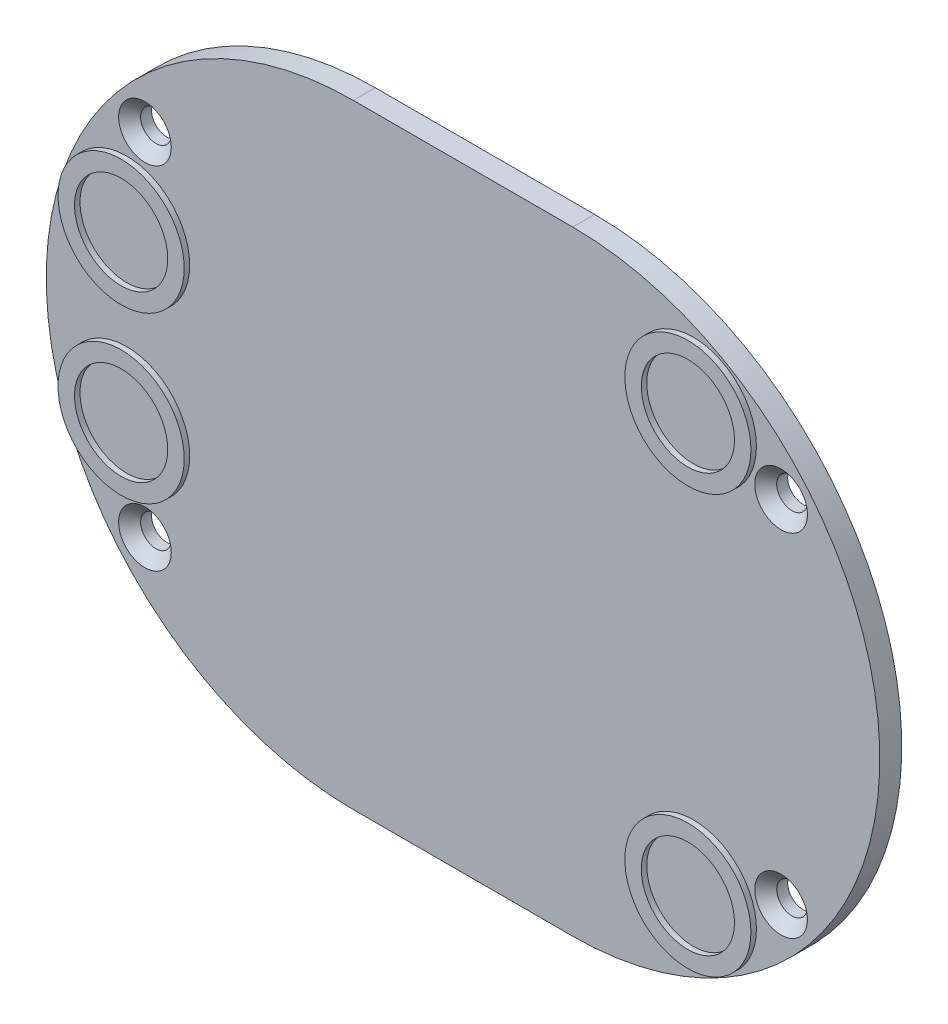
ISO-10303-21;
HEADER;
FILE_DESCRIPTION(('STEP AP214'),'2;1');
FILE_NAME('part.step','',(''),(''),'','','');
FILE_SCHEMA(('AUTOMOTIVE_DESIGN { 1 0 10303 214 1 1 1 1 }'));
ENDSEC;
DATA;
#1=APPLICATION_CONTEXT('core data for automotive mechanical design processes');
#2=APPLICATION_PROTOCOL_DEFINITION('international standard','automotive_design',2000,#1);
#3=PRODUCT_CONTEXT('',#1,'mechanical');
#4=PRODUCT('Part','Part','',(#3));
#5=PRODUCT_RELATED_PRODUCT_CATEGORY('part','',(#4));
#6=PRODUCT_DEFINITION_FORMATION('','',#4);
#7=PRODUCT_DEFINITION_CONTEXT('part definition',#1,'design');
#8=PRODUCT_DEFINITION('design','',#6,#7);
#9=PRODUCT_DEFINITION_SHAPE('','',#8);
#10=(LENGTH_UNIT() NAMED_UNIT(*) SI_UNIT(.MILLI.,.METRE.));
#11=(NAMED_UNIT(*) PLANE_ANGLE_UNIT() SI_UNIT($,.RADIAN.));
#12=(NAMED_UNIT(*) SI_UNIT($,.STERADIAN.) SOLID_ANGLE_UNIT());
#13=UNCERTAINTY_MEASURE_WITH_UNIT(LENGTH_MEASURE(1.E-05),#10,'distance_accuracy_value','');
#14=(GEOMETRIC_REPRESENTATION_CONTEXT(3) GLOBAL_UNCERTAINTY_ASSIGNED_CONTEXT((#13)) GLOBAL_UNIT_ASSIGNED_CONTEXT((#10,
#11,#12)) REPRESENTATION_CONTEXT('',''));
#15=CARTESIAN_POINT('',(0.,0.,0.));
#16=DIRECTION('',(0.,0.,1.));
#17=DIRECTION('',(1.,0.,0.));
#18=AXIS2_PLACEMENT_3D('',#15,#16,#17);
#19=CARTESIAN_POINT('',(-10.,0.,2.));
#20=DIRECTION('',(0.,0.,-1.));
#21=DIRECTION('',(-1.,0.,0.));
#22=AXIS2_PLACEMENT_3D('',#19,#20,#21);
#23=CYLINDRICAL_SURFACE('',#22,28.);
#24=CARTESIAN_POINT('',(-10.,0.,0.));
#25=DIRECTION('',(0.,0.,1.));
#26=DIRECTION('',(1.,0.,0.));
#27=AXIS2_PLACEMENT_3D('',#24,#25,#26);
#28=CIRCLE('',#27,28.);
#29=CARTESIAN_POINT('',(-10.,28.,0.));
#30=VERTEX_POINT('',#29);
#31=CARTESIAN_POINT('',(-10.,-28.,0.));
#32=VERTEX_POINT('',#31);
#33=EDGE_CURVE('E128',#30,#32,#28,.T.);
#34=ORIENTED_EDGE('',*,*,#33,.T.);
#35=DIRECTION('',(0.,0.,-1.));
#36=VECTOR('',#35,1.);
#37=CARTESIAN_POINT('',(-10.,-28.,2.));
#38=LINE('',#37,#36);
#39=CARTESIAN_POINT('',(-10.,-28.,2.));
#40=VERTEX_POINT('',#39);
#41=EDGE_CURVE('E115',#40,#32,#38,.T.);
#42=ORIENTED_EDGE('',*,*,#41,.F.);
#43=CARTESIAN_POINT('',(-10.,0.,2.));
#44=DIRECTION('',(0.,0.,1.));
#45=DIRECTION('',(1.,0.,0.));
#46=AXIS2_PLACEMENT_3D('',#43,#44,#45);
#47=CIRCLE('',#46,28.);
#48=CARTESIAN_POINT('',(-10.,28.,2.));
#49=VERTEX_POINT('',#48);
#50=EDGE_CURVE('E101',#49,#40,#47,.T.);
#51=ORIENTED_EDGE('',*,*,#50,.F.);
#52=DIRECTION('',(0.,0.,-1.));
#53=VECTOR('',#52,1.);
#54=CARTESIAN_POINT('',(-10.,28.,2.));
#55=LINE('',#54,#53);
#56=EDGE_CURVE('E75',#49,#30,#55,.T.);
#57=ORIENTED_EDGE('',*,*,#56,.T.);
#58=EDGE_LOOP('',(#34,#42,#51,#57));
#59=FACE_BOUND('',#58,.T.);
#60=ADVANCED_FACE('F59',(#59),#23,.T.);
#61=CARTESIAN_POINT('',(10.,-28.,2.));
#62=DIRECTION('',(0.,-1.,0.));
#63=DIRECTION('',(1.,0.,0.));
#64=AXIS2_PLACEMENT_3D('',#61,#62,#63);
#65=PLANE('',#64);
#66=DIRECTION('',(-1.,0.,0.));
#67=VECTOR('',#66,1.);
#68=CARTESIAN_POINT('',(10.,-28.,0.));
#69=LINE('',#68,#67);
#70=CARTESIAN_POINT('',(10.,-28.,0.));
#71=VERTEX_POINT('',#70);
#72=EDGE_CURVE('E112',#71,#32,#69,.T.);
#73=ORIENTED_EDGE('',*,*,#72,.F.);
#74=DIRECTION('',(0.,0.,-1.));
#75=VECTOR('',#74,1.);
#76=CARTESIAN_POINT('',(10.,-28.,2.));
#77=LINE('',#76,#75);
#78=CARTESIAN_POINT('',(10.,-28.,2.));
#79=VERTEX_POINT('',#78);
#80=EDGE_CURVE('E107',#79,#71,#77,.T.);
#81=ORIENTED_EDGE('',*,*,#80,.F.);
#82=DIRECTION('',(-1.,0.,0.));
#83=VECTOR('',#82,1.);
#84=CARTESIAN_POINT('',(10.,-28.,2.));
#85=LINE('',#84,#83);
#86=EDGE_CURVE('E110',#79,#40,#85,.T.);
#87=ORIENTED_EDGE('',*,*,#86,.T.);
#88=ORIENTED_EDGE('',*,*,#41,.T.);
#89=EDGE_LOOP('',(#73,#81,#87,#88));
#90=FACE_BOUND('',#89,.T.);
#91=ADVANCED_FACE('F109',(#90),#65,.T.);
#92=CARTESIAN_POINT('',(10.,0.,2.));
#93=DIRECTION('',(0.,0.,-1.));
#94=DIRECTION('',(-1.,0.,0.));
#95=AXIS2_PLACEMENT_3D('',#92,#93,#94);
#96=CYLINDRICAL_SURFACE('',#95,28.);
#97=CARTESIAN_POINT('',(10.,0.,0.));
#98=DIRECTION('',(0.,0.,1.));
#99=DIRECTION('',(1.,0.,0.));
#100=AXIS2_PLACEMENT_3D('',#97,#98,#99);
#101=CIRCLE('',#100,28.);
#102=CARTESIAN_POINT('',(10.,28.,0.));
#103=VERTEX_POINT('',#102);
#104=EDGE_CURVE('E132',#71,#103,#101,.T.);
#105=ORIENTED_EDGE('',*,*,#104,.T.);
#106=DIRECTION('',(0.,0.,-1.));
#107=VECTOR('',#106,1.);
#108=CARTESIAN_POINT('',(10.,28.,2.));
#109=LINE('',#108,#107);
#110=CARTESIAN_POINT('',(10.,28.,2.));
#111=VERTEX_POINT('',#110);
#112=EDGE_CURVE('E90',#111,#103,#109,.T.);
#113=ORIENTED_EDGE('',*,*,#112,.F.);
#114=CARTESIAN_POINT('',(10.,0.,2.));
#115=DIRECTION('',(0.,0.,1.));
#116=DIRECTION('',(1.,0.,0.));
#117=AXIS2_PLACEMENT_3D('',#114,#115,#116);
#118=CIRCLE('',#117,28.);
#119=EDGE_CURVE('E117',#79,#111,#118,.T.);
#120=ORIENTED_EDGE('',*,*,#119,.F.);
#121=ORIENTED_EDGE('',*,*,#80,.T.);
#122=EDGE_LOOP('',(#105,#113,#120,#121));
#123=FACE_BOUND('',#122,.T.);
#124=ADVANCED_FACE('F118',(#123),#96,.T.);
#125=CARTESIAN_POINT('',(-10.,28.,2.));
#126=DIRECTION('',(0.,1.,0.));
#127=DIRECTION('',(-1.,0.,0.));
#128=AXIS2_PLACEMENT_3D('',#125,#126,#127);
#129=PLANE('',#128);
#130=DIRECTION('',(1.,0.,0.));
#131=VECTOR('',#130,1.);
#132=CARTESIAN_POINT('',(-10.,28.,0.));
#133=LINE('',#132,#131);
#134=EDGE_CURVE('E123',#30,#103,#133,.T.);
#135=ORIENTED_EDGE('',*,*,#134,.F.);
#136=ORIENTED_EDGE('',*,*,#56,.F.);
#137=DIRECTION('',(1.,0.,0.));
#138=VECTOR('',#137,1.);
#139=CARTESIAN_POINT('',(-10.,28.,2.));
#140=LINE('',#139,#138);
#141=EDGE_CURVE('E119',#49,#111,#140,.T.);
#142=ORIENTED_EDGE('',*,*,#141,.T.);
#143=ORIENTED_EDGE('',*,*,#112,.T.);
#144=EDGE_LOOP('',(#135,#136,#142,#143));
#145=FACE_BOUND('',#144,.T.);
#146=ADVANCED_FACE('F201',(#145),#129,.T.);
#147=CARTESIAN_POINT('',(-10.,0.,2.));
#148=DIRECTION('',(0.,0.,1.));
#149=DIRECTION('',(1.,0.,0.));
#150=AXIS2_PLACEMENT_3D('',#147,#148,#149);
#151=PLANE('',#150);
#152=CARTESIAN_POINT('',(21.0000000000001,19.0525588832576,2.));
#153=DIRECTION('',(0.,0.,1.));
#154=DIRECTION('',(1.,0.,0.));
#155=AXIS2_PLACEMENT_3D('',#152,#153,#154);
#156=CIRCLE('',#155,5.75);
#157=CARTESIAN_POINT('',(26.7500000000001,19.0525588832576,2.));
#158=VERTEX_POINT('',#157);
#159=EDGE_CURVE('E301',#158,#158,#156,.T.);
#160=ORIENTED_EDGE('',*,*,#159,.F.);
#161=EDGE_LOOP('',(#160));
#162=FACE_BOUND('',#161,.T.);
#163=CARTESIAN_POINT('',(21.0000000000001,-19.0525588832576,2.));
#164=DIRECTION('',(0.,0.,1.));
#165=DIRECTION('',(1.,0.,0.));
#166=AXIS2_PLACEMENT_3D('',#163,#164,#165);
#167=CIRCLE('',#166,5.75);
#168=CARTESIAN_POINT('',(26.7500000000001,-19.0525588832576,2.));
#169=VERTEX_POINT('',#168);
#170=EDGE_CURVE('E312',#169,#169,#167,.T.);
#171=ORIENTED_EDGE('',*,*,#170,.F.);
#172=EDGE_LOOP('',(#171));
#173=FACE_BOUND('',#172,.T.);
#174=CARTESIAN_POINT('',(-30.67323765729,-7.52444315316473,2.));
#175=DIRECTION('',(0.,0.,1.));
#176=DIRECTION('',(1.,0.,0.));
#177=AXIS2_PLACEMENT_3D('',#174,#175,#176);
#178=CIRCLE('',#177,5.75);
#179=CARTESIAN_POINT('',(-24.92323765729,-7.52444315316473,2.));
#180=VERTEX_POINT('',#179);
#181=EDGE_CURVE('E321',#180,#180,#178,.T.);
#182=ORIENTED_EDGE('',*,*,#181,.F.);
#183=EDGE_LOOP('',(#182));
#184=FACE_BOUND('',#183,.T.);
#185=CARTESIAN_POINT('',(-30.67323765729,7.52444315316473,2.));
#186=DIRECTION('',(0.,0.,1.));
#187=DIRECTION('',(1.,0.,0.));
#188=AXIS2_PLACEMENT_3D('',#185,#186,#187);
#189=CIRCLE('',#188,5.75);
#190=CARTESIAN_POINT('',(-24.92323765729,7.52444315316473,2.));
#191=VERTEX_POINT('',#190);
#192=EDGE_CURVE('E330',#191,#191,#189,.T.);
#193=ORIENTED_EDGE('',*,*,#192,.F.);
#194=EDGE_LOOP('',(#193));
#195=FACE_BOUND('',#194,.T.);
#196=CARTESIAN_POINT('',(-29.,16.,2.));
#197=DIRECTION('',(0.,0.,1.));
#198=DIRECTION('',(1.,0.,0.));
#199=AXIS2_PLACEMENT_3D('',#196,#197,#198);
#200=CIRCLE('',#199,2.4);
#201=CARTESIAN_POINT('',(-26.6,16.,2.));
#202=VERTEX_POINT('',#201);
#203=EDGE_CURVE('E334',#202,#202,#200,.T.);
#204=ORIENTED_EDGE('',*,*,#203,.F.);
#205=EDGE_LOOP('',(#204));
#206=FACE_BOUND('',#205,.T.);
#207=CARTESIAN_POINT('',(-29.,-16.,2.));
#208=DIRECTION('',(0.,0.,1.));
#209=DIRECTION('',(1.,0.,0.));
#210=AXIS2_PLACEMENT_3D('',#207,#208,#209);
#211=CIRCLE('',#210,2.4);
#212=CARTESIAN_POINT('',(-26.6,-16.,2.));
#213=VERTEX_POINT('',#212);
#214=EDGE_CURVE('E156',#213,#213,#211,.T.);
#215=ORIENTED_EDGE('',*,*,#214,.F.);
#216=EDGE_LOOP('',(#215));
#217=FACE_BOUND('',#216,.T.);
#218=CARTESIAN_POINT('',(29.,16.,2.));
#219=DIRECTION('',(0.,0.,1.));
#220=DIRECTION('',(1.,0.,0.));
#221=AXIS2_PLACEMENT_3D('',#218,#219,#220);
#222=CIRCLE('',#221,2.4);
#223=CARTESIAN_POINT('',(31.4,16.,2.));
#224=VERTEX_POINT('',#223);
#225=EDGE_CURVE('E151',#224,#224,#222,.T.);
#226=ORIENTED_EDGE('',*,*,#225,.F.);
#227=EDGE_LOOP('',(#226));
#228=FACE_BOUND('',#227,.T.);
#229=CARTESIAN_POINT('',(29.,-16.,2.));
#230=DIRECTION('',(0.,0.,1.));
#231=DIRECTION('',(1.,0.,0.));
#232=AXIS2_PLACEMENT_3D('',#229,#230,#231);
#233=CIRCLE('',#232,2.4);
#234=CARTESIAN_POINT('',(31.4,-16.,2.));
#235=VERTEX_POINT('',#234);
#236=EDGE_CURVE('E146',#235,#235,#233,.T.);
#237=ORIENTED_EDGE('',*,*,#236,.F.);
#238=EDGE_LOOP('',(#237));
#239=FACE_BOUND('',#238,.T.);
#240=ORIENTED_EDGE('',*,*,#50,.T.);
#241=ORIENTED_EDGE('',*,*,#86,.F.);
#242=ORIENTED_EDGE('',*,*,#119,.T.);
#243=ORIENTED_EDGE('',*,*,#141,.F.);
#244=EDGE_LOOP('',(#240,#241,#242,#243));
#245=FACE_BOUND('',#244,.T.);
#246=ADVANCED_FACE('F121',(#162,#173,#184,#195,#206,#217,#228,#239,#245),#151,.T.);
#247=CARTESIAN_POINT('',(-10.,0.,0.));
#248=DIRECTION('',(0.,0.,1.));
#249=DIRECTION('',(1.,0.,0.));
#250=AXIS2_PLACEMENT_3D('',#247,#248,#249);
#251=PLANE('',#250);
#252=CARTESIAN_POINT('',(-29.,16.,0.));
#253=DIRECTION('',(0.,0.,1.));
#254=DIRECTION('',(1.,0.,0.));
#255=AXIS2_PLACEMENT_3D('',#252,#253,#254);
#256=CIRCLE('',#255,1.4);
#257=CARTESIAN_POINT('',(-27.6,16.,0.));
#258=VERTEX_POINT('',#257);
#259=EDGE_CURVE('E153',#258,#258,#256,.T.);
#260=ORIENTED_EDGE('',*,*,#259,.T.);
#261=EDGE_LOOP('',(#260));
#262=FACE_BOUND('',#261,.T.);
#263=CARTESIAN_POINT('',(-29.,-16.,0.));
#264=DIRECTION('',(0.,0.,1.));
#265=DIRECTION('',(1.,0.,0.));
#266=AXIS2_PLACEMENT_3D('',#263,#264,#265);
#267=CIRCLE('',#266,1.4);
#268=CARTESIAN_POINT('',(-27.6,-16.,0.));
#269=VERTEX_POINT('',#268);
#270=EDGE_CURVE('E148',#269,#269,#267,.T.);
#271=ORIENTED_EDGE('',*,*,#270,.T.);
#272=EDGE_LOOP('',(#271));
#273=FACE_BOUND('',#272,.T.);
#274=CARTESIAN_POINT('',(29.,16.,0.));
#275=DIRECTION('',(0.,0.,1.));
#276=DIRECTION('',(1.,0.,0.));
#277=AXIS2_PLACEMENT_3D('',#274,#275,#276);
#278=CIRCLE('',#277,1.4);
#279=CARTESIAN_POINT('',(30.4,16.,0.));
#280=VERTEX_POINT('',#279);
#281=EDGE_CURVE('E143',#280,#280,#278,.T.);
#282=ORIENTED_EDGE('',*,*,#281,.T.);
#283=EDGE_LOOP('',(#282));
#284=FACE_BOUND('',#283,.T.);
#285=CARTESIAN_POINT('',(29.,-16.,0.));
#286=DIRECTION('',(0.,0.,1.));
#287=DIRECTION('',(1.,0.,0.));
#288=AXIS2_PLACEMENT_3D('',#285,#286,#287);
#289=CIRCLE('',#288,1.4);
#290=CARTESIAN_POINT('',(30.4,-16.,0.));
#291=VERTEX_POINT('',#290);
#292=EDGE_CURVE('E130',#291,#291,#289,.T.);
#293=ORIENTED_EDGE('',*,*,#292,.T.);
#294=EDGE_LOOP('',(#293));
#295=FACE_BOUND('',#294,.T.);
#296=ORIENTED_EDGE('',*,*,#33,.F.);
#297=ORIENTED_EDGE('',*,*,#134,.T.);
#298=ORIENTED_EDGE('',*,*,#104,.F.);
#299=ORIENTED_EDGE('',*,*,#72,.T.);
#300=EDGE_LOOP('',(#296,#297,#298,#299));
#301=FACE_BOUND('',#300,.T.);
#302=ADVANCED_FACE('F200',(#262,#273,#284,#295,#301),#251,.F.);
#303=CARTESIAN_POINT('',(29.,-16.,2.));
#304=DIRECTION('',(0.,0.,1.));
#305=DIRECTION('',(1.,0.,0.));
#306=AXIS2_PLACEMENT_3D('',#303,#304,#305);
#307=CYLINDRICAL_SURFACE('',#306,1.4);
#308=CARTESIAN_POINT('',(29.,-16.,0.999999999999999));
#309=DIRECTION('',(0.,0.,1.));
#310=DIRECTION('',(1.,0.,0.));
#311=AXIS2_PLACEMENT_3D('',#308,#309,#310);
#312=CIRCLE('',#311,1.4);
#313=CARTESIAN_POINT('',(30.4,-16.,0.999999999999999));
#314=VERTEX_POINT('',#313);
#315=EDGE_CURVE('E142',#314,#314,#312,.T.);
#316=ORIENTED_EDGE('',*,*,#315,.T.);
#317=EDGE_LOOP('',(#316));
#318=FACE_BOUND('',#317,.T.);
#319=ORIENTED_EDGE('',*,*,#292,.F.);
#320=EDGE_LOOP('',(#319));
#321=FACE_BOUND('',#320,.T.);
#322=ADVANCED_FACE('F212',(#318,#321),#307,.F.);
#323=CARTESIAN_POINT('',(29.,-16.,2.));
#324=DIRECTION('',(0.,0.,1.));
#325=DIRECTION('',(1.,0.,0.));
#326=AXIS2_PLACEMENT_3D('',#323,#324,#325);
#327=CONICAL_SURFACE('',#326,2.4,0.78539816339745);
#328=ORIENTED_EDGE('',*,*,#315,.F.);
#329=EDGE_LOOP('',(#328));
#330=FACE_BOUND('',#329,.T.);
#331=ORIENTED_EDGE('',*,*,#236,.T.);
#332=EDGE_LOOP('',(#331));
#333=FACE_BOUND('',#332,.T.);
#334=ADVANCED_FACE('F217',(#330,#333),#327,.F.);
#335=CARTESIAN_POINT('',(29.,16.,2.));
#336=DIRECTION('',(0.,0.,1.));
#337=DIRECTION('',(1.,0.,0.));
#338=AXIS2_PLACEMENT_3D('',#335,#336,#337);
#339=CYLINDRICAL_SURFACE('',#338,1.4);
#340=CARTESIAN_POINT('',(29.,16.,0.999999999999999));
#341=DIRECTION('',(0.,0.,1.));
#342=DIRECTION('',(1.,0.,0.));
#343=AXIS2_PLACEMENT_3D('',#340,#341,#342);
#344=CIRCLE('',#343,1.4);
#345=CARTESIAN_POINT('',(30.4,16.,0.999999999999999));
#346=VERTEX_POINT('',#345);
#347=EDGE_CURVE('E147',#346,#346,#344,.T.);
#348=ORIENTED_EDGE('',*,*,#347,.T.);
#349=EDGE_LOOP('',(#348));
#350=FACE_BOUND('',#349,.T.);
#351=ORIENTED_EDGE('',*,*,#281,.F.);
#352=EDGE_LOOP('',(#351));
#353=FACE_BOUND('',#352,.T.);
#354=ADVANCED_FACE('F228',(#350,#353),#339,.F.);
#355=CARTESIAN_POINT('',(29.,16.,2.));
#356=DIRECTION('',(0.,0.,1.));
#357=DIRECTION('',(1.,0.,0.));
#358=AXIS2_PLACEMENT_3D('',#355,#356,#357);
#359=CONICAL_SURFACE('',#358,2.4,0.78539816339745);
#360=ORIENTED_EDGE('',*,*,#347,.F.);
#361=EDGE_LOOP('',(#360));
#362=FACE_BOUND('',#361,.T.);
#363=ORIENTED_EDGE('',*,*,#225,.T.);
#364=EDGE_LOOP('',(#363));
#365=FACE_BOUND('',#364,.T.);
#366=ADVANCED_FACE('F230',(#362,#365),#359,.F.);
#367=CARTESIAN_POINT('',(-29.,-16.,2.));
#368=DIRECTION('',(0.,0.,1.));
#369=DIRECTION('',(1.,0.,0.));
#370=AXIS2_PLACEMENT_3D('',#367,#368,#369);
#371=CYLINDRICAL_SURFACE('',#370,1.4);
#372=CARTESIAN_POINT('',(-29.,-16.,0.999999999999999));
#373=DIRECTION('',(0.,0.,1.));
#374=DIRECTION('',(1.,0.,0.));
#375=AXIS2_PLACEMENT_3D('',#372,#373,#374);
#376=CIRCLE('',#375,1.4);
#377=CARTESIAN_POINT('',(-27.6,-16.,0.999999999999999));
#378=VERTEX_POINT('',#377);
#379=EDGE_CURVE('E152',#378,#378,#376,.T.);
#380=ORIENTED_EDGE('',*,*,#379,.T.);
#381=EDGE_LOOP('',(#380));
#382=FACE_BOUND('',#381,.T.);
#383=ORIENTED_EDGE('',*,*,#270,.F.);
#384=EDGE_LOOP('',(#383));
#385=FACE_BOUND('',#384,.T.);
#386=ADVANCED_FACE('F237',(#382,#385),#371,.F.);
#387=CARTESIAN_POINT('',(-29.,-16.,2.));
#388=DIRECTION('',(0.,0.,1.));
#389=DIRECTION('',(1.,0.,0.));
#390=AXIS2_PLACEMENT_3D('',#387,#388,#389);
#391=CONICAL_SURFACE('',#390,2.4,0.785398163397448);
#392=ORIENTED_EDGE('',*,*,#379,.F.);
#393=EDGE_LOOP('',(#392));
#394=FACE_BOUND('',#393,.T.);
#395=ORIENTED_EDGE('',*,*,#214,.T.);
#396=EDGE_LOOP('',(#395));
#397=FACE_BOUND('',#396,.T.);
#398=ADVANCED_FACE('F246',(#394,#397),#391,.F.);
#399=CARTESIAN_POINT('',(-29.,16.,2.));
#400=DIRECTION('',(0.,0.,1.));
#401=DIRECTION('',(1.,0.,0.));
#402=AXIS2_PLACEMENT_3D('',#399,#400,#401);
#403=CYLINDRICAL_SURFACE('',#402,1.4);
#404=CARTESIAN_POINT('',(-29.,16.,0.999999999999999));
#405=DIRECTION('',(0.,0.,1.));
#406=DIRECTION('',(1.,0.,0.));
#407=AXIS2_PLACEMENT_3D('',#404,#405,#406);
#408=CIRCLE('',#407,1.4);
#409=CARTESIAN_POINT('',(-27.6,16.,0.999999999999999));
#410=VERTEX_POINT('',#409);
#411=EDGE_CURVE('E157',#410,#410,#408,.T.);
#412=ORIENTED_EDGE('',*,*,#411,.T.);
#413=EDGE_LOOP('',(#412));
#414=FACE_BOUND('',#413,.T.);
#415=ORIENTED_EDGE('',*,*,#259,.F.);
#416=EDGE_LOOP('',(#415));
#417=FACE_BOUND('',#416,.T.);
#418=ADVANCED_FACE('F250',(#414,#417),#403,.F.);
#419=CARTESIAN_POINT('',(-29.,16.,2.));
#420=DIRECTION('',(0.,0.,1.));
#421=DIRECTION('',(1.,0.,0.));
#422=AXIS2_PLACEMENT_3D('',#419,#420,#421);
#423=CONICAL_SURFACE('',#422,2.4,0.785398163397448);
#424=ORIENTED_EDGE('',*,*,#411,.F.);
#425=EDGE_LOOP('',(#424));
#426=FACE_BOUND('',#425,.T.);
#427=ORIENTED_EDGE('',*,*,#203,.T.);
#428=EDGE_LOOP('',(#427));
#429=FACE_BOUND('',#428,.T.);
#430=ADVANCED_FACE('F254',(#426,#429),#423,.F.);
#431=CARTESIAN_POINT('',(-30.67323765729,7.52444315316473,2.5));
#432=DIRECTION('',(0.,0.,1.));
#433=DIRECTION('',(1.,0.,0.));
#434=AXIS2_PLACEMENT_3D('',#431,#432,#433);
#435=PLANE('',#434);
#436=CARTESIAN_POINT('',(-30.67323765729,7.52444315316473,2.5));
#437=DIRECTION('',(0.,0.,1.));
#438=DIRECTION('',(1.,0.,0.));
#439=AXIS2_PLACEMENT_3D('',#436,#437,#438);
#440=CIRCLE('',#439,5.75);
#441=CARTESIAN_POINT('',(-24.92323765729,7.52444315316473,2.5));
#442=VERTEX_POINT('',#441);
#443=EDGE_CURVE('E331',#442,#442,#440,.T.);
#444=ORIENTED_EDGE('',*,*,#443,.T.);
#445=EDGE_LOOP('',(#444));
#446=FACE_BOUND('',#445,.T.);
#447=CARTESIAN_POINT('',(-30.67323765729,7.52444315316473,2.5));
#448=DIRECTION('',(0.,0.,1.));
#449=DIRECTION('',(1.,0.,0.));
#450=AXIS2_PLACEMENT_3D('',#447,#448,#449);
#451=CIRCLE('',#450,4.25);
#452=CARTESIAN_POINT('',(-26.42323765729,7.52444315316473,2.5));
#453=VERTEX_POINT('',#452);
#454=EDGE_CURVE('E325',#453,#453,#451,.T.);
#455=ORIENTED_EDGE('',*,*,#454,.F.);
#456=EDGE_LOOP('',(#455));
#457=FACE_BOUND('',#456,.T.);
#458=ADVANCED_FACE('F258',(#446,#457),#435,.T.);
#459=CARTESIAN_POINT('',(-30.67323765729,7.52444315316473,2.5));
#460=DIRECTION('',(0.,0.,-1.));
#461=DIRECTION('',(-1.,0.,0.));
#462=AXIS2_PLACEMENT_3D('',#459,#460,#461);
#463=CYLINDRICAL_SURFACE('',#462,5.75);
#464=ORIENTED_EDGE('',*,*,#443,.F.);
#465=EDGE_LOOP('',(#464));
#466=FACE_BOUND('',#465,.T.);
#467=ORIENTED_EDGE('',*,*,#192,.T.);
#468=EDGE_LOOP('',(#467));
#469=FACE_BOUND('',#468,.T.);
#470=ADVANCED_FACE('F260',(#466,#469),#463,.T.);
#471=CARTESIAN_POINT('',(-30.67323765729,7.52444315316473,2.5));
#472=DIRECTION('',(0.,0.,-1.));
#473=DIRECTION('',(-1.,0.,0.));
#474=AXIS2_PLACEMENT_3D('',#471,#472,#473);
#475=CYLINDRICAL_SURFACE('',#474,4.25);
#476=ORIENTED_EDGE('',*,*,#454,.T.);
#477=EDGE_LOOP('',(#476));
#478=FACE_BOUND('',#477,.T.);
#479=CARTESIAN_POINT('',(-30.67323765729,7.52444315316473,2.));
#480=DIRECTION('',(0.,0.,1.));
#481=DIRECTION('',(1.,0.,0.));
#482=AXIS2_PLACEMENT_3D('',#479,#480,#481);
#483=CIRCLE('',#482,4.25);
#484=CARTESIAN_POINT('',(-26.42323765729,7.52444315316473,2.));
#485=VERTEX_POINT('',#484);
#486=EDGE_CURVE('E139',#485,#485,#483,.F.);
#487=ORIENTED_EDGE('',*,*,#486,.T.);
#488=EDGE_LOOP('',(#487));
#489=FACE_BOUND('',#488,.T.);
#490=ADVANCED_FACE('F263',(#478,#489),#475,.F.);
#491=ORIENTED_EDGE('',*,*,#486,.F.);
#492=EDGE_LOOP('',(#491));
#493=FACE_BOUND('',#492,.T.);
#494=ADVANCED_FACE('F191',(#493),#151,.T.);
#495=CARTESIAN_POINT('',(-30.67323765729,-7.52444315316473,2.5));
#496=DIRECTION('',(0.,0.,1.));
#497=DIRECTION('',(1.,0.,0.));
#498=AXIS2_PLACEMENT_3D('',#495,#496,#497);
#499=PLANE('',#498);
#500=CARTESIAN_POINT('',(-30.67323765729,-7.52444315316473,2.5));
#501=DIRECTION('',(0.,0.,1.));
#502=DIRECTION('',(1.,0.,0.));
#503=AXIS2_PLACEMENT_3D('',#500,#501,#502);
#504=CIRCLE('',#503,5.75);
#505=CARTESIAN_POINT('',(-24.92323765729,-7.52444315316473,2.5));
#506=VERTEX_POINT('',#505);
#507=EDGE_CURVE('E322',#506,#506,#504,.T.);
#508=ORIENTED_EDGE('',*,*,#507,.T.);
#509=EDGE_LOOP('',(#508));
#510=FACE_BOUND('',#509,.T.);
#511=CARTESIAN_POINT('',(-30.67323765729,-7.52444315316473,2.5));
#512=DIRECTION('',(0.,0.,1.));
#513=DIRECTION('',(1.,0.,0.));
#514=AXIS2_PLACEMENT_3D('',#511,#512,#513);
#515=CIRCLE('',#514,4.25);
#516=CARTESIAN_POINT('',(-26.42323765729,-7.52444315316473,2.5));
#517=VERTEX_POINT('',#516);
#518=EDGE_CURVE('E316',#517,#517,#515,.T.);
#519=ORIENTED_EDGE('',*,*,#518,.F.);
#520=EDGE_LOOP('',(#519));
#521=FACE_BOUND('',#520,.T.);
#522=ADVANCED_FACE('F274',(#510,#521),#499,.T.);
#523=CARTESIAN_POINT('',(-30.67323765729,-7.52444315316473,2.5));
#524=DIRECTION('',(0.,0.,-1.));
#525=DIRECTION('',(-1.,0.,0.));
#526=AXIS2_PLACEMENT_3D('',#523,#524,#525);
#527=CYLINDRICAL_SURFACE('',#526,5.75);
#528=ORIENTED_EDGE('',*,*,#507,.F.);
#529=EDGE_LOOP('',(#528));
#530=FACE_BOUND('',#529,.T.);
#531=ORIENTED_EDGE('',*,*,#181,.T.);
#532=EDGE_LOOP('',(#531));
#533=FACE_BOUND('',#532,.T.);
#534=ADVANCED_FACE('F271',(#530,#533),#527,.T.);
#535=CARTESIAN_POINT('',(-30.67323765729,-7.52444315316473,2.5));
#536=DIRECTION('',(0.,0.,-1.));
#537=DIRECTION('',(-1.,0.,0.));
#538=AXIS2_PLACEMENT_3D('',#535,#536,#537);
#539=CYLINDRICAL_SURFACE('',#538,4.25);
#540=ORIENTED_EDGE('',*,*,#518,.T.);
#541=EDGE_LOOP('',(#540));
#542=FACE_BOUND('',#541,.T.);
#543=CARTESIAN_POINT('',(-30.67323765729,-7.52444315316473,2.));
#544=DIRECTION('',(0.,0.,1.));
#545=DIRECTION('',(1.,0.,0.));
#546=AXIS2_PLACEMENT_3D('',#543,#544,#545);
#547=CIRCLE('',#546,4.25);
#548=CARTESIAN_POINT('',(-26.42323765729,-7.52444315316473,2.));
#549=VERTEX_POINT('',#548);
#550=EDGE_CURVE('E160',#549,#549,#547,.F.);
#551=ORIENTED_EDGE('',*,*,#550,.T.);
#552=EDGE_LOOP('',(#551));
#553=FACE_BOUND('',#552,.T.);
#554=ADVANCED_FACE('F189',(#542,#553),#539,.F.);
#555=ORIENTED_EDGE('',*,*,#550,.F.);
#556=EDGE_LOOP('',(#555));
#557=FACE_BOUND('',#556,.T.);
#558=ADVANCED_FACE('F171',(#557),#151,.T.);
#559=CARTESIAN_POINT('',(21.0000000000001,-19.0525588832576,2.5));
#560=DIRECTION('',(0.,0.,1.));
#561=DIRECTION('',(1.,0.,0.));
#562=AXIS2_PLACEMENT_3D('',#559,#560,#561);
#563=PLANE('',#562);
#564=CARTESIAN_POINT('',(21.0000000000001,-19.0525588832576,2.5));
#565=DIRECTION('',(0.,0.,1.));
#566=DIRECTION('',(1.,0.,0.));
#567=AXIS2_PLACEMENT_3D('',#564,#565,#566);
#568=CIRCLE('',#567,5.75);
#569=CARTESIAN_POINT('',(26.7500000000001,-19.0525588832576,2.5));
#570=VERTEX_POINT('',#569);
#571=EDGE_CURVE('E313',#570,#570,#568,.T.);
#572=ORIENTED_EDGE('',*,*,#571,.T.);
#573=EDGE_LOOP('',(#572));
#574=FACE_BOUND('',#573,.T.);
#575=CARTESIAN_POINT('',(21.0000000000001,-19.0525588832576,2.5));
#576=DIRECTION('',(0.,0.,1.));
#577=DIRECTION('',(1.,0.,0.));
#578=AXIS2_PLACEMENT_3D('',#575,#576,#577);
#579=CIRCLE('',#578,4.25);
#580=CARTESIAN_POINT('',(25.2500000000001,-19.0525588832576,2.5));
#581=VERTEX_POINT('',#580);
#582=EDGE_CURVE('E308',#581,#581,#579,.T.);
#583=ORIENTED_EDGE('',*,*,#582,.F.);
#584=EDGE_LOOP('',(#583));
#585=FACE_BOUND('',#584,.T.);
#586=ADVANCED_FACE('F188',(#574,#585),#563,.T.);
#587=CARTESIAN_POINT('',(21.0000000000001,-19.0525588832576,2.5));
#588=DIRECTION('',(0.,0.,-1.));
#589=DIRECTION('',(-1.,0.,0.));
#590=AXIS2_PLACEMENT_3D('',#587,#588,#589);
#591=CYLINDRICAL_SURFACE('',#590,5.75);
#592=ORIENTED_EDGE('',*,*,#571,.F.);
#593=EDGE_LOOP('',(#592));
#594=FACE_BOUND('',#593,.T.);
#595=ORIENTED_EDGE('',*,*,#170,.T.);
#596=EDGE_LOOP('',(#595));
#597=FACE_BOUND('',#596,.T.);
#598=ADVANCED_FACE('F182',(#594,#597),#591,.T.);
#599=CARTESIAN_POINT('',(21.0000000000001,-19.0525588832576,2.5));
#600=DIRECTION('',(0.,0.,-1.));
#601=DIRECTION('',(-1.,0.,0.));
#602=AXIS2_PLACEMENT_3D('',#599,#600,#601);
#603=CYLINDRICAL_SURFACE('',#602,4.25);
#604=ORIENTED_EDGE('',*,*,#582,.T.);
#605=EDGE_LOOP('',(#604));
#606=FACE_BOUND('',#605,.T.);
#607=CARTESIAN_POINT('',(21.0000000000001,-19.0525588832576,2.));
#608=DIRECTION('',(0.,0.,1.));
#609=DIRECTION('',(1.,0.,0.));
#610=AXIS2_PLACEMENT_3D('',#607,#608,#609);
#611=CIRCLE('',#610,4.25);
#612=CARTESIAN_POINT('',(25.2500000000001,-19.0525588832576,2.));
#613=VERTEX_POINT('',#612);
#614=EDGE_CURVE('E67',#613,#613,#611,.F.);
#615=ORIENTED_EDGE('',*,*,#614,.T.);
#616=EDGE_LOOP('',(#615));
#617=FACE_BOUND('',#616,.T.);
#618=ADVANCED_FACE('F165',(#606,#617),#603,.F.);
#619=ORIENTED_EDGE('',*,*,#614,.F.);
#620=EDGE_LOOP('',(#619));
#621=FACE_BOUND('',#620,.T.);
#622=ADVANCED_FACE('F167',(#621),#151,.T.);
#623=CARTESIAN_POINT('',(21.0000000000001,19.0525588832576,2.5));
#624=DIRECTION('',(0.,0.,1.));
#625=DIRECTION('',(1.,0.,0.));
#626=AXIS2_PLACEMENT_3D('',#623,#624,#625);
#627=PLANE('',#626);
#628=CARTESIAN_POINT('',(21.0000000000001,19.0525588832576,2.5));
#629=DIRECTION('',(0.,0.,1.));
#630=DIRECTION('',(1.,0.,0.));
#631=AXIS2_PLACEMENT_3D('',#628,#629,#630);
#632=CIRCLE('',#631,5.75);
#633=CARTESIAN_POINT('',(26.7500000000001,19.0525588832576,2.5));
#634=VERTEX_POINT('',#633);
#635=EDGE_CURVE('E304',#634,#634,#632,.T.);
#636=ORIENTED_EDGE('',*,*,#635,.T.);
#637=EDGE_LOOP('',(#636));
#638=FACE_BOUND('',#637,.T.);
#639=CARTESIAN_POINT('',(21.0000000000001,19.0525588832576,2.5));
#640=DIRECTION('',(0.,0.,1.));
#641=DIRECTION('',(1.,0.,0.));
#642=AXIS2_PLACEMENT_3D('',#639,#640,#641);
#643=CIRCLE('',#642,4.25);
#644=CARTESIAN_POINT('',(25.2500000000001,19.0525588832576,2.5));
#645=VERTEX_POINT('',#644);
#646=EDGE_CURVE('E298',#645,#645,#643,.T.);
#647=ORIENTED_EDGE('',*,*,#646,.F.);
#648=EDGE_LOOP('',(#647));
#649=FACE_BOUND('',#648,.T.);
#650=ADVANCED_FACE('F169',(#638,#649),#627,.T.);
#651=CARTESIAN_POINT('',(21.0000000000001,19.0525588832576,2.5));
#652=DIRECTION('',(0.,0.,-1.));
#653=DIRECTION('',(-1.,0.,0.));
#654=AXIS2_PLACEMENT_3D('',#651,#652,#653);
#655=CYLINDRICAL_SURFACE('',#654,5.75);
#656=ORIENTED_EDGE('',*,*,#635,.F.);
#657=EDGE_LOOP('',(#656));
#658=FACE_BOUND('',#657,.T.);
#659=ORIENTED_EDGE('',*,*,#159,.T.);
#660=EDGE_LOOP('',(#659));
#661=FACE_BOUND('',#660,.T.);
#662=ADVANCED_FACE('F178',(#658,#661),#655,.T.);
#663=CARTESIAN_POINT('',(21.0000000000001,19.0525588832576,2.5));
#664=DIRECTION('',(0.,0.,-1.));
#665=DIRECTION('',(-1.,0.,0.));
#666=AXIS2_PLACEMENT_3D('',#663,#664,#665);
#667=CYLINDRICAL_SURFACE('',#666,4.25);
#668=ORIENTED_EDGE('',*,*,#646,.T.);
#669=EDGE_LOOP('',(#668));
#670=FACE_BOUND('',#669,.T.);
#671=CARTESIAN_POINT('',(21.0000000000001,19.0525588832576,2.));
#672=DIRECTION('',(0.,0.,1.));
#673=DIRECTION('',(1.,0.,0.));
#674=AXIS2_PLACEMENT_3D('',#671,#672,#673);
#675=CIRCLE('',#674,4.25);
#676=CARTESIAN_POINT('',(25.2500000000001,19.0525588832576,2.));
#677=VERTEX_POINT('',#676);
#678=EDGE_CURVE('E12',#677,#677,#675,.F.);
#679=ORIENTED_EDGE('',*,*,#678,.T.);
#680=EDGE_LOOP('',(#679));
#681=FACE_BOUND('',#680,.T.);
#682=ADVANCED_FACE('F193',(#670,#681),#667,.F.);
#683=ORIENTED_EDGE('',*,*,#678,.F.);
#684=EDGE_LOOP('',(#683));
#685=FACE_BOUND('',#684,.T.);
#686=ADVANCED_FACE('F172',(#685),#151,.T.);
#687=CLOSED_SHELL('',(#60,#91,#124,#146,#246,#302,#322,#334,#354,#366,#386,#398,#418,#430,#458,
#470,#490,#494,#522,#534,#554,#558,#586,#598,#618,#622,#650,#662,#682,#686));
#688=MANIFOLD_SOLID_BREP('B2',#687);
#689=ADVANCED_BREP_SHAPE_REPRESENTATION('',(#18,#688),#14);
#690=SHAPE_DEFINITION_REPRESENTATION(#9,#689);
ENDSEC;
END-ISO-10303-21;
